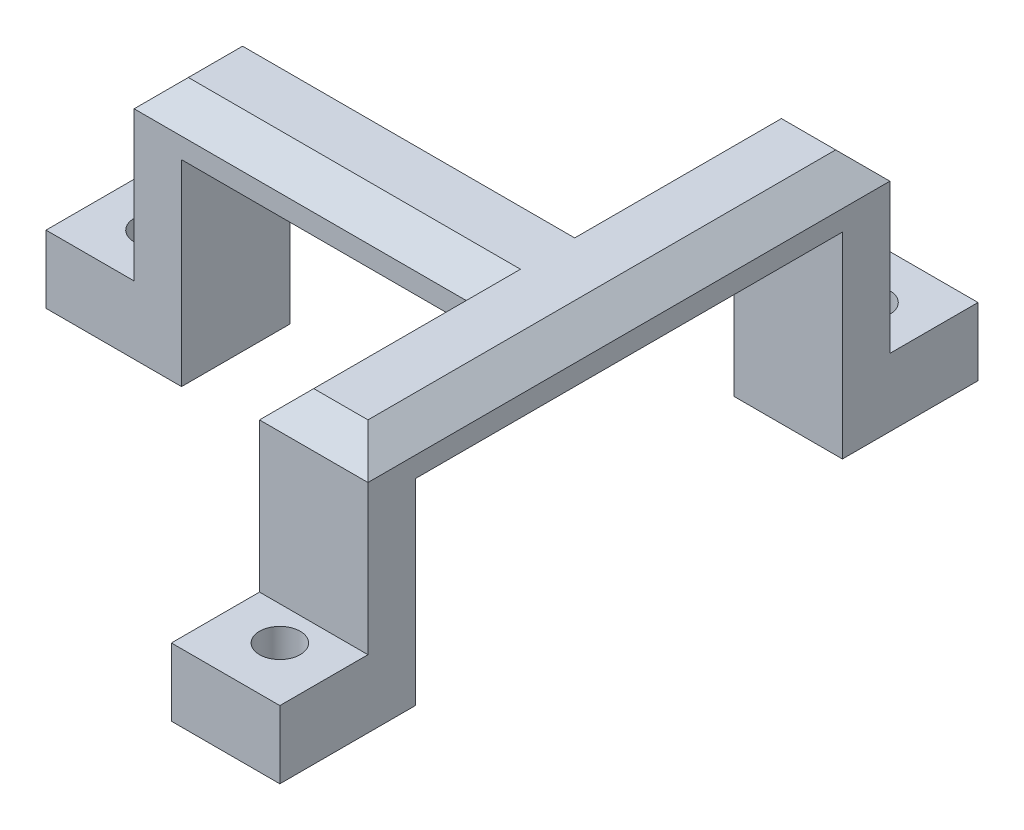
ISO-10303-21;
HEADER;
FILE_DESCRIPTION(('STEP AP214'),'2;1');
FILE_NAME('part.step','',(''),(''),'','','');
FILE_SCHEMA(('AUTOMOTIVE_DESIGN { 1 0 10303 214 1 1 1 1 }'));
ENDSEC;
DATA;
#1=APPLICATION_CONTEXT('core data for automotive mechanical design processes');
#2=APPLICATION_PROTOCOL_DEFINITION('international standard','automotive_design',2000,#1);
#3=PRODUCT_CONTEXT('',#1,'mechanical');
#4=PRODUCT('Part','Part','',(#3));
#5=PRODUCT_RELATED_PRODUCT_CATEGORY('part','',(#4));
#6=PRODUCT_DEFINITION_FORMATION('','',#4);
#7=PRODUCT_DEFINITION_CONTEXT('part definition',#1,'design');
#8=PRODUCT_DEFINITION('design','',#6,#7);
#9=PRODUCT_DEFINITION_SHAPE('','',#8);
#10=(LENGTH_UNIT() NAMED_UNIT(*) SI_UNIT(.MILLI.,.METRE.));
#11=(NAMED_UNIT(*) PLANE_ANGLE_UNIT() SI_UNIT($,.RADIAN.));
#12=(NAMED_UNIT(*) SI_UNIT($,.STERADIAN.) SOLID_ANGLE_UNIT());
#13=UNCERTAINTY_MEASURE_WITH_UNIT(LENGTH_MEASURE(1.E-05),#10,'distance_accuracy_value','');
#14=(GEOMETRIC_REPRESENTATION_CONTEXT(3) GLOBAL_UNCERTAINTY_ASSIGNED_CONTEXT((#13)) GLOBAL_UNIT_ASSIGNED_CONTEXT((#10,
#11,#12)) REPRESENTATION_CONTEXT('',''));
#15=CARTESIAN_POINT('',(0.,0.,0.));
#16=DIRECTION('',(0.,0.,1.));
#17=DIRECTION('',(1.,0.,0.));
#18=AXIS2_PLACEMENT_3D('',#15,#16,#17);
#19=CARTESIAN_POINT('',(-4.,5.,15.75));
#20=DIRECTION('',(0.,0.,1.));
#21=DIRECTION('',(1.,0.,0.));
#22=AXIS2_PLACEMENT_3D('',#19,#20,#21);
#23=PLANE('',#22);
#24=DIRECTION('',(-1.,0.,0.));
#25=VECTOR('',#24,1.);
#26=CARTESIAN_POINT('',(4.,14.5,15.75));
#27=LINE('',#26,#25);
#28=CARTESIAN_POINT('',(4.,14.5,15.75));
#29=VERTEX_POINT('',#28);
#30=CARTESIAN_POINT('',(-4.,14.5,15.75));
#31=VERTEX_POINT('',#30);
#32=EDGE_CURVE('E361',#29,#31,#27,.T.);
#33=ORIENTED_EDGE('',*,*,#32,.F.);
#34=DIRECTION('',(0.,-1.,0.));
#35=VECTOR('',#34,1.);
#36=CARTESIAN_POINT('',(4.,5.,15.75));
#37=LINE('',#36,#35);
#38=CARTESIAN_POINT('',(4.,0.,15.75));
#39=VERTEX_POINT('',#38);
#40=EDGE_CURVE('E422',#29,#39,#37,.T.);
#41=ORIENTED_EDGE('',*,*,#40,.T.);
#42=DIRECTION('',(-1.,0.,0.));
#43=VECTOR('',#42,1.);
#44=CARTESIAN_POINT('',(-4.,0.,15.75));
#45=LINE('',#44,#43);
#46=CARTESIAN_POINT('',(-4.,0.,15.75));
#47=VERTEX_POINT('',#46);
#48=EDGE_CURVE('E399',#39,#47,#45,.T.);
#49=ORIENTED_EDGE('',*,*,#48,.T.);
#50=DIRECTION('',(0.,-1.,0.));
#51=VECTOR('',#50,1.);
#52=CARTESIAN_POINT('',(-4.,5.,15.75));
#53=LINE('',#52,#51);
#54=EDGE_CURVE('E406',#31,#47,#53,.T.);
#55=ORIENTED_EDGE('',*,*,#54,.F.);
#56=EDGE_LOOP('',(#33,#41,#49,#55));
#57=FACE_BOUND('',#56,.T.);
#58=ADVANCED_FACE('F43',(#57),#23,.F.);
#59=CARTESIAN_POINT('',(0.,5.,0.));
#60=DIRECTION('',(0.,1.,0.));
#61=DIRECTION('',(0.,0.,1.));
#62=AXIS2_PLACEMENT_3D('',#59,#60,#61);
#63=PLANE('',#62);
#64=DIRECTION('',(1.,0.,0.));
#65=VECTOR('',#64,1.);
#66=CARTESIAN_POINT('',(-4.,5.,19.25));
#67=LINE('',#66,#65);
#68=CARTESIAN_POINT('',(-4.,5.,19.25));
#69=VERTEX_POINT('',#68);
#70=CARTESIAN_POINT('',(4.,5.,19.25));
#71=VERTEX_POINT('',#70);
#72=EDGE_CURVE('E370',#69,#71,#67,.T.);
#73=ORIENTED_EDGE('',*,*,#72,.F.);
#74=DIRECTION('',(0.,0.,1.));
#75=VECTOR('',#74,1.);
#76=CARTESIAN_POINT('',(-4.,5.,15.75));
#77=LINE('',#76,#75);
#78=CARTESIAN_POINT('',(-4.,5.,25.75));
#79=VERTEX_POINT('',#78);
#80=EDGE_CURVE('E395',#69,#79,#77,.T.);
#81=ORIENTED_EDGE('',*,*,#80,.T.);
#82=DIRECTION('',(1.,0.,0.));
#83=VECTOR('',#82,1.);
#84=CARTESIAN_POINT('',(-4.,5.,25.75));
#85=LINE('',#84,#83);
#86=CARTESIAN_POINT('',(4.,5.,25.75));
#87=VERTEX_POINT('',#86);
#88=EDGE_CURVE('E398',#79,#87,#85,.T.);
#89=ORIENTED_EDGE('',*,*,#88,.T.);
#90=DIRECTION('',(0.,0.,-1.));
#91=VECTOR('',#90,1.);
#92=CARTESIAN_POINT('',(4.,5.,15.75));
#93=LINE('',#92,#91);
#94=EDGE_CURVE('E402',#87,#71,#93,.T.);
#95=ORIENTED_EDGE('',*,*,#94,.T.);
#96=EDGE_LOOP('',(#73,#81,#89,#95));
#97=FACE_BOUND('',#96,.T.);
#98=CARTESIAN_POINT('',(0.,5.,21.75));
#99=DIRECTION('',(0.,1.,0.));
#100=DIRECTION('',(0.,0.,1.));
#101=AXIS2_PLACEMENT_3D('',#98,#99,#100);
#102=CIRCLE('',#101,1.5);
#103=CARTESIAN_POINT('',(0.,5.,23.25));
#104=VERTEX_POINT('',#103);
#105=EDGE_CURVE('E387',#104,#104,#102,.T.);
#106=ORIENTED_EDGE('',*,*,#105,.F.);
#107=EDGE_LOOP('',(#106));
#108=FACE_BOUND('',#107,.T.);
#109=ADVANCED_FACE('F595',(#97,#108),#63,.T.);
#110=CARTESIAN_POINT('',(0.,0.,0.));
#111=DIRECTION('',(0.,1.,0.));
#112=DIRECTION('',(0.,0.,1.));
#113=AXIS2_PLACEMENT_3D('',#110,#111,#112);
#114=PLANE('',#113);
#115=DIRECTION('',(0.,0.,1.));
#116=VECTOR('',#115,1.);
#117=CARTESIAN_POINT('',(-4.,0.,15.75));
#118=LINE('',#117,#116);
#119=CARTESIAN_POINT('',(-4.,0.,25.75));
#120=VERTEX_POINT('',#119);
#121=EDGE_CURVE('E391',#47,#120,#118,.T.);
#122=ORIENTED_EDGE('',*,*,#121,.F.);
#123=ORIENTED_EDGE('',*,*,#48,.F.);
#124=DIRECTION('',(0.,0.,-1.));
#125=VECTOR('',#124,1.);
#126=CARTESIAN_POINT('',(4.,0.,15.75));
#127=LINE('',#126,#125);
#128=CARTESIAN_POINT('',(4.,0.,25.75));
#129=VERTEX_POINT('',#128);
#130=EDGE_CURVE('E413',#129,#39,#127,.T.);
#131=ORIENTED_EDGE('',*,*,#130,.F.);
#132=DIRECTION('',(1.,0.,0.));
#133=VECTOR('',#132,1.);
#134=CARTESIAN_POINT('',(-4.,0.,25.75));
#135=LINE('',#134,#133);
#136=EDGE_CURVE('E410',#120,#129,#135,.T.);
#137=ORIENTED_EDGE('',*,*,#136,.F.);
#138=EDGE_LOOP('',(#122,#123,#131,#137));
#139=FACE_BOUND('',#138,.T.);
#140=CARTESIAN_POINT('',(0.,0.,21.75));
#141=DIRECTION('',(0.,1.,0.));
#142=DIRECTION('',(0.,0.,1.));
#143=AXIS2_PLACEMENT_3D('',#140,#141,#142);
#144=CIRCLE('',#143,1.5);
#145=CARTESIAN_POINT('',(0.,0.,23.25));
#146=VERTEX_POINT('',#145);
#147=EDGE_CURVE('E386',#146,#146,#144,.T.);
#148=ORIENTED_EDGE('',*,*,#147,.T.);
#149=EDGE_LOOP('',(#148));
#150=FACE_BOUND('',#149,.T.);
#151=ADVANCED_FACE('F586',(#139,#150),#114,.F.);
#152=CARTESIAN_POINT('',(-4.,5.,15.75));
#153=DIRECTION('',(1.,0.,0.));
#154=DIRECTION('',(0.,0.,-1.));
#155=AXIS2_PLACEMENT_3D('',#152,#153,#154);
#156=PLANE('',#155);
#157=DIRECTION('',(0.,-1.,0.));
#158=VECTOR('',#157,1.);
#159=CARTESIAN_POINT('',(-4.,18.,19.25));
#160=LINE('',#159,#158);
#161=CARTESIAN_POINT('',(-4.,16.,19.25));
#162=VERTEX_POINT('',#161);
#163=EDGE_CURVE('E383',#162,#69,#160,.T.);
#164=ORIENTED_EDGE('',*,*,#163,.F.);
#165=DIRECTION('',(0.,0.,-1.));
#166=VECTOR('',#165,1.);
#167=CARTESIAN_POINT('',(-4.,16.,15.75));
#168=LINE('',#167,#166);
#169=CARTESIAN_POINT('',(-4.,16.,4.));
#170=VERTEX_POINT('',#169);
#171=EDGE_CURVE('E11',#162,#170,#168,.T.);
#172=ORIENTED_EDGE('',*,*,#171,.T.);
#173=DIRECTION('',(0.,1.,0.));
#174=VECTOR('',#173,1.);
#175=CARTESIAN_POINT('',(-4.,18.,4.));
#176=LINE('',#175,#174);
#177=CARTESIAN_POINT('',(-4.,14.5,4.));
#178=VERTEX_POINT('',#177);
#179=EDGE_CURVE('E366',#178,#170,#176,.T.);
#180=ORIENTED_EDGE('',*,*,#179,.F.);
#181=DIRECTION('',(0.,0.,1.));
#182=VECTOR('',#181,1.);
#183=CARTESIAN_POINT('',(-4.,14.5,-4.73212459828649));
#184=LINE('',#183,#182);
#185=EDGE_CURVE('E365',#178,#31,#184,.T.);
#186=ORIENTED_EDGE('',*,*,#185,.T.);
#187=ORIENTED_EDGE('',*,*,#54,.T.);
#188=ORIENTED_EDGE('',*,*,#121,.T.);
#189=DIRECTION('',(0.,-1.,0.));
#190=VECTOR('',#189,1.);
#191=CARTESIAN_POINT('',(-4.,5.,25.75));
#192=LINE('',#191,#190);
#193=EDGE_CURVE('E429',#79,#120,#192,.T.);
#194=ORIENTED_EDGE('',*,*,#193,.F.);
#195=ORIENTED_EDGE('',*,*,#80,.F.);
#196=EDGE_LOOP('',(#164,#172,#180,#186,#187,#188,#194,#195));
#197=FACE_BOUND('',#196,.T.);
#198=ADVANCED_FACE('F524',(#197),#156,.F.);
#199=CARTESIAN_POINT('',(-4.,5.,25.75));
#200=DIRECTION('',(0.,0.,-1.));
#201=DIRECTION('',(-1.,0.,0.));
#202=AXIS2_PLACEMENT_3D('',#199,#200,#201);
#203=PLANE('',#202);
#204=ORIENTED_EDGE('',*,*,#136,.T.);
#205=DIRECTION('',(0.,-1.,0.));
#206=VECTOR('',#205,1.);
#207=CARTESIAN_POINT('',(4.,5.,25.75));
#208=LINE('',#207,#206);
#209=EDGE_CURVE('E425',#87,#129,#208,.T.);
#210=ORIENTED_EDGE('',*,*,#209,.F.);
#211=ORIENTED_EDGE('',*,*,#88,.F.);
#212=ORIENTED_EDGE('',*,*,#193,.T.);
#213=EDGE_LOOP('',(#204,#210,#211,#212));
#214=FACE_BOUND('',#213,.T.);
#215=ADVANCED_FACE('F591',(#214),#203,.F.);
#216=CARTESIAN_POINT('',(4.,5.,15.75));
#217=DIRECTION('',(-1.,0.,0.));
#218=DIRECTION('',(0.,0.,1.));
#219=AXIS2_PLACEMENT_3D('',#216,#217,#218);
#220=PLANE('',#219);
#221=DIRECTION('',(0.,-1.,0.));
#222=VECTOR('',#221,1.);
#223=CARTESIAN_POINT('',(4.,18.,-19.25));
#224=LINE('',#223,#222);
#225=CARTESIAN_POINT('',(4.,16.,-19.25));
#226=VERTEX_POINT('',#225);
#227=CARTESIAN_POINT('',(4.,5.,-19.25));
#228=VERTEX_POINT('',#227);
#229=EDGE_CURVE('E311',#226,#228,#224,.T.);
#230=ORIENTED_EDGE('',*,*,#229,.F.);
#231=DIRECTION('',(0.,0.,1.));
#232=VECTOR('',#231,1.);
#233=CARTESIAN_POINT('',(4.,16.,15.75));
#234=LINE('',#233,#232);
#235=CARTESIAN_POINT('',(4.,16.,19.25));
#236=VERTEX_POINT('',#235);
#237=EDGE_CURVE('E69',#226,#236,#234,.T.);
#238=ORIENTED_EDGE('',*,*,#237,.T.);
#239=DIRECTION('',(0.,-1.,0.));
#240=VECTOR('',#239,1.);
#241=CARTESIAN_POINT('',(4.,18.,19.25));
#242=LINE('',#241,#240);
#243=EDGE_CURVE('E380',#236,#71,#242,.T.);
#244=ORIENTED_EDGE('',*,*,#243,.T.);
#245=ORIENTED_EDGE('',*,*,#94,.F.);
#246=ORIENTED_EDGE('',*,*,#209,.T.);
#247=ORIENTED_EDGE('',*,*,#130,.T.);
#248=ORIENTED_EDGE('',*,*,#40,.F.);
#249=DIRECTION('',(0.,0.,1.));
#250=VECTOR('',#249,1.);
#251=CARTESIAN_POINT('',(4.,14.5,-4.73212459828649));
#252=LINE('',#251,#250);
#253=CARTESIAN_POINT('',(4.,14.5,-15.75));
#254=VERTEX_POINT('',#253);
#255=EDGE_CURVE('E360',#254,#29,#252,.T.);
#256=ORIENTED_EDGE('',*,*,#255,.F.);
#257=DIRECTION('',(0.,-1.,0.));
#258=VECTOR('',#257,1.);
#259=CARTESIAN_POINT('',(4.,5.,-15.75));
#260=LINE('',#259,#258);
#261=CARTESIAN_POINT('',(4.,0.,-15.75));
#262=VERTEX_POINT('',#261);
#263=EDGE_CURVE('E354',#254,#262,#260,.T.);
#264=ORIENTED_EDGE('',*,*,#263,.T.);
#265=DIRECTION('',(0.,0.,-1.));
#266=VECTOR('',#265,1.);
#267=CARTESIAN_POINT('',(4.,0.,-25.75));
#268=LINE('',#267,#266);
#269=CARTESIAN_POINT('',(4.,0.,-25.75));
#270=VERTEX_POINT('',#269);
#271=EDGE_CURVE('E342',#262,#270,#268,.T.);
#272=ORIENTED_EDGE('',*,*,#271,.T.);
#273=DIRECTION('',(0.,-1.,0.));
#274=VECTOR('',#273,1.);
#275=CARTESIAN_POINT('',(4.,5.,-25.75));
#276=LINE('',#275,#274);
#277=CARTESIAN_POINT('',(4.,5.,-25.75));
#278=VERTEX_POINT('',#277);
#279=EDGE_CURVE('E350',#278,#270,#276,.T.);
#280=ORIENTED_EDGE('',*,*,#279,.F.);
#281=DIRECTION('',(0.,0.,-1.));
#282=VECTOR('',#281,1.);
#283=CARTESIAN_POINT('',(4.,5.,-25.75));
#284=LINE('',#283,#282);
#285=EDGE_CURVE('E327',#228,#278,#284,.T.);
#286=ORIENTED_EDGE('',*,*,#285,.F.);
#287=EDGE_LOOP('',(#230,#238,#244,#245,#246,#247,#248,#256,#264,#272,#280,#286));
#288=FACE_BOUND('',#287,.T.);
#289=ADVANCED_FACE('F563',(#288),#220,.F.);
#290=CARTESIAN_POINT('',(0.,5.,21.75));
#291=DIRECTION('',(0.,-1.,0.));
#292=DIRECTION('',(0.,0.,-1.));
#293=AXIS2_PLACEMENT_3D('',#290,#291,#292);
#294=CYLINDRICAL_SURFACE('',#293,1.5);
#295=ORIENTED_EDGE('',*,*,#105,.T.);
#296=EDGE_LOOP('',(#295));
#297=FACE_BOUND('',#296,.T.);
#298=ORIENTED_EDGE('',*,*,#147,.F.);
#299=EDGE_LOOP('',(#298));
#300=FACE_BOUND('',#299,.T.);
#301=ADVANCED_FACE('F599',(#297,#300),#294,.F.);
#302=CARTESIAN_POINT('',(-4.,18.,19.25));
#303=DIRECTION('',(0.,0.,-1.));
#304=DIRECTION('',(-1.,0.,0.));
#305=AXIS2_PLACEMENT_3D('',#302,#303,#304);
#306=PLANE('',#305);
#307=ORIENTED_EDGE('',*,*,#243,.F.);
#308=DIRECTION('',(-1.,0.,0.));
#309=VECTOR('',#308,1.);
#310=CARTESIAN_POINT('',(-4.,16.,19.25));
#311=LINE('',#310,#309);
#312=EDGE_CURVE('E54',#236,#162,#311,.T.);
#313=ORIENTED_EDGE('',*,*,#312,.T.);
#314=ORIENTED_EDGE('',*,*,#163,.T.);
#315=ORIENTED_EDGE('',*,*,#72,.T.);
#316=EDGE_LOOP('',(#307,#313,#314,#315));
#317=FACE_BOUND('',#316,.T.);
#318=ADVANCED_FACE('F597',(#317),#306,.F.);
#319=CARTESIAN_POINT('',(0.,18.,0.));
#320=DIRECTION('',(0.,-1.,0.));
#321=DIRECTION('',(0.,0.,-1.));
#322=AXIS2_PLACEMENT_3D('',#319,#320,#321);
#323=PLANE('',#322);
#324=DIRECTION('',(0.,0.,1.));
#325=VECTOR('',#324,1.);
#326=CARTESIAN_POINT('',(-26.5,18.,0.));
#327=LINE('',#326,#325);
#328=CARTESIAN_POINT('',(-26.5,18.,-2.00000000000001));
#329=VERTEX_POINT('',#328);
#330=CARTESIAN_POINT('',(-26.5,18.,2.00000000000001));
#331=VERTEX_POINT('',#330);
#332=EDGE_CURVE('E451',#329,#331,#327,.T.);
#333=ORIENTED_EDGE('',*,*,#332,.T.);
#334=DIRECTION('',(1.,0.,0.));
#335=VECTOR('',#334,1.);
#336=CARTESIAN_POINT('',(0.,18.,2.00000000000001));
#337=LINE('',#336,#335);
#338=CARTESIAN_POINT('',(-2.00000000000001,18.,2.00000000000001));
#339=VERTEX_POINT('',#338);
#340=EDGE_CURVE('E454',#331,#339,#337,.T.);
#341=ORIENTED_EDGE('',*,*,#340,.T.);
#342=DIRECTION('',(0.,0.,1.));
#343=VECTOR('',#342,1.);
#344=CARTESIAN_POINT('',(-2.00000000000002,18.,0.));
#345=LINE('',#344,#343);
#346=CARTESIAN_POINT('',(-2.00000000000001,18.,17.25));
#347=VERTEX_POINT('',#346);
#348=EDGE_CURVE('E433',#339,#347,#345,.T.);
#349=ORIENTED_EDGE('',*,*,#348,.T.);
#350=DIRECTION('',(1.,0.,0.));
#351=VECTOR('',#350,1.);
#352=CARTESIAN_POINT('',(0.,18.,17.25));
#353=LINE('',#352,#351);
#354=CARTESIAN_POINT('',(2.00000000000001,18.,17.25));
#355=VERTEX_POINT('',#354);
#356=EDGE_CURVE('E436',#347,#355,#353,.T.);
#357=ORIENTED_EDGE('',*,*,#356,.T.);
#358=DIRECTION('',(0.,0.,-1.));
#359=VECTOR('',#358,1.);
#360=CARTESIAN_POINT('',(2.00000000000001,18.,0.));
#361=LINE('',#360,#359);
#362=CARTESIAN_POINT('',(2.00000000000001,18.,-17.25));
#363=VERTEX_POINT('',#362);
#364=EDGE_CURVE('E439',#355,#363,#361,.T.);
#365=ORIENTED_EDGE('',*,*,#364,.T.);
#366=DIRECTION('',(-1.,0.,0.));
#367=VECTOR('',#366,1.);
#368=CARTESIAN_POINT('',(0.,18.,-17.25));
#369=LINE('',#368,#367);
#370=CARTESIAN_POINT('',(-2.00000000000001,18.,-17.25));
#371=VERTEX_POINT('',#370);
#372=EDGE_CURVE('E442',#363,#371,#369,.T.);
#373=ORIENTED_EDGE('',*,*,#372,.T.);
#374=DIRECTION('',(0.,0.,1.));
#375=VECTOR('',#374,1.);
#376=CARTESIAN_POINT('',(-2.00000000000001,18.,0.));
#377=LINE('',#376,#375);
#378=CARTESIAN_POINT('',(-2.00000000000001,18.,-2.00000000000001));
#379=VERTEX_POINT('',#378);
#380=EDGE_CURVE('E445',#371,#379,#377,.T.);
#381=ORIENTED_EDGE('',*,*,#380,.T.);
#382=DIRECTION('',(-1.,0.,0.));
#383=VECTOR('',#382,1.);
#384=CARTESIAN_POINT('',(0.,18.,-2.00000000000001));
#385=LINE('',#384,#383);
#386=EDGE_CURVE('E448',#379,#329,#385,.T.);
#387=ORIENTED_EDGE('',*,*,#386,.T.);
#388=EDGE_LOOP('',(#333,#341,#349,#357,#365,#373,#381,#387));
#389=FACE_BOUND('',#388,.T.);
#390=ADVANCED_FACE('F512',(#389),#323,.F.);
#391=CARTESIAN_POINT('',(4.,14.5,-4.73212459828649));
#392=DIRECTION('',(0.,1.,0.));
#393=DIRECTION('',(0.,0.,1.));
#394=AXIS2_PLACEMENT_3D('',#391,#392,#393);
#395=PLANE('',#394);
#396=ORIENTED_EDGE('',*,*,#185,.F.);
#397=DIRECTION('',(-1.,0.,0.));
#398=VECTOR('',#397,1.);
#399=CARTESIAN_POINT('',(12.7321245982865,14.5,4.));
#400=LINE('',#399,#398);
#401=CARTESIAN_POINT('',(-25.,14.5,4.));
#402=VERTEX_POINT('',#401);
#403=EDGE_CURVE('E219',#178,#402,#400,.T.);
#404=ORIENTED_EDGE('',*,*,#403,.T.);
#405=DIRECTION('',(0.,0.,-1.));
#406=VECTOR('',#405,1.);
#407=CARTESIAN_POINT('',(-25.,14.5,-4.));
#408=LINE('',#407,#406);
#409=CARTESIAN_POINT('',(-25.,14.5,-4.));
#410=VERTEX_POINT('',#409);
#411=EDGE_CURVE('E220',#402,#410,#408,.T.);
#412=ORIENTED_EDGE('',*,*,#411,.T.);
#413=DIRECTION('',(-1.,0.,0.));
#414=VECTOR('',#413,1.);
#415=CARTESIAN_POINT('',(12.7321245982865,14.5,-4.));
#416=LINE('',#415,#414);
#417=CARTESIAN_POINT('',(-4.,14.5,-4.));
#418=VERTEX_POINT('',#417);
#419=EDGE_CURVE('E206',#418,#410,#416,.T.);
#420=ORIENTED_EDGE('',*,*,#419,.F.);
#421=DIRECTION('',(0.,0.,-1.));
#422=VECTOR('',#421,1.);
#423=CARTESIAN_POINT('',(-4.,14.5,4.73212459828649));
#424=LINE('',#423,#422);
#425=CARTESIAN_POINT('',(-4.,14.5,-15.75));
#426=VERTEX_POINT('',#425);
#427=EDGE_CURVE('E295',#418,#426,#424,.T.);
#428=ORIENTED_EDGE('',*,*,#427,.T.);
#429=DIRECTION('',(1.,0.,0.));
#430=VECTOR('',#429,1.);
#431=CARTESIAN_POINT('',(4.,14.5,-15.75));
#432=LINE('',#431,#430);
#433=EDGE_CURVE('E296',#426,#254,#432,.T.);
#434=ORIENTED_EDGE('',*,*,#433,.T.);
#435=ORIENTED_EDGE('',*,*,#255,.T.);
#436=ORIENTED_EDGE('',*,*,#32,.T.);
#437=EDGE_LOOP('',(#396,#404,#412,#420,#428,#434,#435,#436));
#438=FACE_BOUND('',#437,.T.);
#439=ADVANCED_FACE('F234',(#438),#395,.F.);
#440=CARTESIAN_POINT('',(-35.,5.,4.));
#441=DIRECTION('',(0.,0.,-1.));
#442=DIRECTION('',(-1.,0.,0.));
#443=AXIS2_PLACEMENT_3D('',#440,#441,#442);
#444=PLANE('',#443);
#445=ORIENTED_EDGE('',*,*,#179,.T.);
#446=DIRECTION('',(-1.,0.,0.));
#447=VECTOR('',#446,1.);
#448=CARTESIAN_POINT('',(-35.,16.,4.));
#449=LINE('',#448,#447);
#450=CARTESIAN_POINT('',(-28.5,16.,4.));
#451=VERTEX_POINT('',#450);
#452=EDGE_CURVE('E458',#170,#451,#449,.T.);
#453=ORIENTED_EDGE('',*,*,#452,.T.);
#454=DIRECTION('',(0.,-1.,0.));
#455=VECTOR('',#454,1.);
#456=CARTESIAN_POINT('',(-28.5,18.,4.));
#457=LINE('',#456,#455);
#458=CARTESIAN_POINT('',(-28.5,5.,4.));
#459=VERTEX_POINT('',#458);
#460=EDGE_CURVE('E248',#451,#459,#457,.T.);
#461=ORIENTED_EDGE('',*,*,#460,.T.);
#462=DIRECTION('',(1.,0.,0.));
#463=VECTOR('',#462,1.);
#464=CARTESIAN_POINT('',(-35.,5.,4.));
#465=LINE('',#464,#463);
#466=CARTESIAN_POINT('',(-35.,5.,4.));
#467=VERTEX_POINT('',#466);
#468=EDGE_CURVE('E267',#467,#459,#465,.T.);
#469=ORIENTED_EDGE('',*,*,#468,.F.);
#470=DIRECTION('',(0.,-1.,0.));
#471=VECTOR('',#470,1.);
#472=CARTESIAN_POINT('',(-35.,5.,4.));
#473=LINE('',#472,#471);
#474=CARTESIAN_POINT('',(-35.,0.,4.));
#475=VERTEX_POINT('',#474);
#476=EDGE_CURVE('E291',#467,#475,#473,.T.);
#477=ORIENTED_EDGE('',*,*,#476,.T.);
#478=DIRECTION('',(1.,0.,0.));
#479=VECTOR('',#478,1.);
#480=CARTESIAN_POINT('',(-35.,0.,4.));
#481=LINE('',#480,#479);
#482=CARTESIAN_POINT('',(-25.,0.,4.));
#483=VERTEX_POINT('',#482);
#484=EDGE_CURVE('E278',#475,#483,#481,.T.);
#485=ORIENTED_EDGE('',*,*,#484,.T.);
#486=DIRECTION('',(0.,-1.,0.));
#487=VECTOR('',#486,1.);
#488=CARTESIAN_POINT('',(-25.,5.,4.));
#489=LINE('',#488,#487);
#490=EDGE_CURVE('E230',#402,#483,#489,.T.);
#491=ORIENTED_EDGE('',*,*,#490,.F.);
#492=ORIENTED_EDGE('',*,*,#403,.F.);
#493=EDGE_LOOP('',(#445,#453,#461,#469,#477,#485,#491,#492));
#494=FACE_BOUND('',#493,.T.);
#495=ADVANCED_FACE('F528',(#494),#444,.F.);
#496=CARTESIAN_POINT('',(-4.,5.,-15.75));
#497=DIRECTION('',(0.,0.,-1.));
#498=DIRECTION('',(-1.,0.,0.));
#499=AXIS2_PLACEMENT_3D('',#496,#497,#498);
#500=PLANE('',#499);
#501=ORIENTED_EDGE('',*,*,#433,.F.);
#502=DIRECTION('',(0.,-1.,0.));
#503=VECTOR('',#502,1.);
#504=CARTESIAN_POINT('',(-4.,5.,-15.75));
#505=LINE('',#504,#503);
#506=CARTESIAN_POINT('',(-4.,0.,-15.75));
#507=VERTEX_POINT('',#506);
#508=EDGE_CURVE('E357',#426,#507,#505,.T.);
#509=ORIENTED_EDGE('',*,*,#508,.T.);
#510=DIRECTION('',(1.,0.,0.));
#511=VECTOR('',#510,1.);
#512=CARTESIAN_POINT('',(-4.,0.,-15.75));
#513=LINE('',#512,#511);
#514=EDGE_CURVE('E338',#507,#262,#513,.T.);
#515=ORIENTED_EDGE('',*,*,#514,.T.);
#516=ORIENTED_EDGE('',*,*,#263,.F.);
#517=EDGE_LOOP('',(#501,#509,#515,#516));
#518=FACE_BOUND('',#517,.T.);
#519=ADVANCED_FACE('F578',(#518),#500,.F.);
#520=CARTESIAN_POINT('',(0.,5.,0.));
#521=DIRECTION('',(0.,1.,0.));
#522=DIRECTION('',(0.,0.,1.));
#523=AXIS2_PLACEMENT_3D('',#520,#521,#522);
#524=PLANE('',#523);
#525=DIRECTION('',(-1.,0.,0.));
#526=VECTOR('',#525,1.);
#527=CARTESIAN_POINT('',(-4.,5.,-19.25));
#528=LINE('',#527,#526);
#529=CARTESIAN_POINT('',(-4.,5.,-19.25));
#530=VERTEX_POINT('',#529);
#531=EDGE_CURVE('E302',#228,#530,#528,.T.);
#532=ORIENTED_EDGE('',*,*,#531,.F.);
#533=ORIENTED_EDGE('',*,*,#285,.T.);
#534=DIRECTION('',(-1.,0.,0.));
#535=VECTOR('',#534,1.);
#536=CARTESIAN_POINT('',(-4.,5.,-25.75));
#537=LINE('',#536,#535);
#538=CARTESIAN_POINT('',(-4.,5.,-25.75));
#539=VERTEX_POINT('',#538);
#540=EDGE_CURVE('E331',#278,#539,#537,.T.);
#541=ORIENTED_EDGE('',*,*,#540,.T.);
#542=DIRECTION('',(0.,0.,1.));
#543=VECTOR('',#542,1.);
#544=CARTESIAN_POINT('',(-4.,5.,-25.75));
#545=LINE('',#544,#543);
#546=EDGE_CURVE('E323',#539,#530,#545,.T.);
#547=ORIENTED_EDGE('',*,*,#546,.T.);
#548=EDGE_LOOP('',(#532,#533,#541,#547));
#549=FACE_BOUND('',#548,.T.);
#550=CARTESIAN_POINT('',(0.,5.,-21.75));
#551=DIRECTION('',(0.,1.,0.));
#552=DIRECTION('',(0.,0.,1.));
#553=AXIS2_PLACEMENT_3D('',#550,#551,#552);
#554=CIRCLE('',#553,1.5);
#555=CARTESIAN_POINT('',(0.,5.,-20.25));
#556=VERTEX_POINT('',#555);
#557=EDGE_CURVE('E315',#556,#556,#554,.T.);
#558=ORIENTED_EDGE('',*,*,#557,.F.);
#559=EDGE_LOOP('',(#558));
#560=FACE_BOUND('',#559,.T.);
#561=ADVANCED_FACE('F560',(#549,#560),#524,.T.);
#562=CARTESIAN_POINT('',(0.,0.,0.));
#563=DIRECTION('',(0.,1.,0.));
#564=DIRECTION('',(0.,0.,1.));
#565=AXIS2_PLACEMENT_3D('',#562,#563,#564);
#566=PLANE('',#565);
#567=DIRECTION('',(0.,0.,1.));
#568=VECTOR('',#567,1.);
#569=CARTESIAN_POINT('',(-4.,0.,-25.75));
#570=LINE('',#569,#568);
#571=CARTESIAN_POINT('',(-4.,0.,-25.75));
#572=VERTEX_POINT('',#571);
#573=EDGE_CURVE('E319',#572,#507,#570,.T.);
#574=ORIENTED_EDGE('',*,*,#573,.F.);
#575=DIRECTION('',(-1.,0.,0.));
#576=VECTOR('',#575,1.);
#577=CARTESIAN_POINT('',(-4.,0.,-25.75));
#578=LINE('',#577,#576);
#579=EDGE_CURVE('E328',#270,#572,#578,.T.);
#580=ORIENTED_EDGE('',*,*,#579,.F.);
#581=ORIENTED_EDGE('',*,*,#271,.F.);
#582=ORIENTED_EDGE('',*,*,#514,.F.);
#583=EDGE_LOOP('',(#574,#580,#581,#582));
#584=FACE_BOUND('',#583,.T.);
#585=CARTESIAN_POINT('',(0.,0.,-21.75));
#586=DIRECTION('',(0.,1.,0.));
#587=DIRECTION('',(0.,0.,1.));
#588=AXIS2_PLACEMENT_3D('',#585,#586,#587);
#589=CIRCLE('',#588,1.5);
#590=CARTESIAN_POINT('',(0.,0.,-20.25));
#591=VERTEX_POINT('',#590);
#592=EDGE_CURVE('E314',#591,#591,#589,.T.);
#593=ORIENTED_EDGE('',*,*,#592,.T.);
#594=EDGE_LOOP('',(#593));
#595=FACE_BOUND('',#594,.T.);
#596=ADVANCED_FACE('F574',(#584,#595),#566,.F.);
#597=CARTESIAN_POINT('',(-4.,5.,-25.75));
#598=DIRECTION('',(1.,0.,0.));
#599=DIRECTION('',(0.,0.,-1.));
#600=AXIS2_PLACEMENT_3D('',#597,#598,#599);
#601=PLANE('',#600);
#602=DIRECTION('',(0.,-1.,0.));
#603=VECTOR('',#602,1.);
#604=CARTESIAN_POINT('',(-4.,18.,-4.));
#605=LINE('',#604,#603);
#606=CARTESIAN_POINT('',(-4.,16.,-4.));
#607=VERTEX_POINT('',#606);
#608=EDGE_CURVE('E213',#607,#418,#605,.T.);
#609=ORIENTED_EDGE('',*,*,#608,.F.);
#610=DIRECTION('',(0.,0.,-1.));
#611=VECTOR('',#610,1.);
#612=CARTESIAN_POINT('',(-4.,16.,-25.75));
#613=LINE('',#612,#611);
#614=CARTESIAN_POINT('',(-4.,16.,-19.25));
#615=VERTEX_POINT('',#614);
#616=EDGE_CURVE('E468',#607,#615,#613,.T.);
#617=ORIENTED_EDGE('',*,*,#616,.T.);
#618=DIRECTION('',(0.,-1.,0.));
#619=VECTOR('',#618,1.);
#620=CARTESIAN_POINT('',(-4.,18.,-19.25));
#621=LINE('',#620,#619);
#622=EDGE_CURVE('E308',#615,#530,#621,.T.);
#623=ORIENTED_EDGE('',*,*,#622,.T.);
#624=ORIENTED_EDGE('',*,*,#546,.F.);
#625=DIRECTION('',(0.,-1.,0.));
#626=VECTOR('',#625,1.);
#627=CARTESIAN_POINT('',(-4.,5.,-25.75));
#628=LINE('',#627,#626);
#629=EDGE_CURVE('E334',#539,#572,#628,.T.);
#630=ORIENTED_EDGE('',*,*,#629,.T.);
#631=ORIENTED_EDGE('',*,*,#573,.T.);
#632=ORIENTED_EDGE('',*,*,#508,.F.);
#633=ORIENTED_EDGE('',*,*,#427,.F.);
#634=EDGE_LOOP('',(#609,#617,#623,#624,#630,#631,#632,#633));
#635=FACE_BOUND('',#634,.T.);
#636=ADVANCED_FACE('F553',(#635),#601,.F.);
#637=CARTESIAN_POINT('',(-4.,5.,-25.75));
#638=DIRECTION('',(0.,0.,1.));
#639=DIRECTION('',(1.,0.,0.));
#640=AXIS2_PLACEMENT_3D('',#637,#638,#639);
#641=PLANE('',#640);
#642=ORIENTED_EDGE('',*,*,#579,.T.);
#643=ORIENTED_EDGE('',*,*,#629,.F.);
#644=ORIENTED_EDGE('',*,*,#540,.F.);
#645=ORIENTED_EDGE('',*,*,#279,.T.);
#646=EDGE_LOOP('',(#642,#643,#644,#645));
#647=FACE_BOUND('',#646,.T.);
#648=ADVANCED_FACE('F569',(#647),#641,.F.);
#649=CARTESIAN_POINT('',(0.,5.,-21.75));
#650=DIRECTION('',(0.,-1.,0.));
#651=DIRECTION('',(0.,0.,-1.));
#652=AXIS2_PLACEMENT_3D('',#649,#650,#651);
#653=CYLINDRICAL_SURFACE('',#652,1.5);
#654=ORIENTED_EDGE('',*,*,#557,.T.);
#655=EDGE_LOOP('',(#654));
#656=FACE_BOUND('',#655,.T.);
#657=ORIENTED_EDGE('',*,*,#592,.F.);
#658=EDGE_LOOP('',(#657));
#659=FACE_BOUND('',#658,.T.);
#660=ADVANCED_FACE('F689',(#656,#659),#653,.F.);
#661=CARTESIAN_POINT('',(-4.,18.,-19.25));
#662=DIRECTION('',(0.,0.,1.));
#663=DIRECTION('',(1.,0.,0.));
#664=AXIS2_PLACEMENT_3D('',#661,#662,#663);
#665=PLANE('',#664);
#666=ORIENTED_EDGE('',*,*,#622,.F.);
#667=DIRECTION('',(1.,0.,0.));
#668=VECTOR('',#667,1.);
#669=CARTESIAN_POINT('',(-4.,16.,-19.25));
#670=LINE('',#669,#668);
#671=EDGE_CURVE('E471',#615,#226,#670,.T.);
#672=ORIENTED_EDGE('',*,*,#671,.T.);
#673=ORIENTED_EDGE('',*,*,#229,.T.);
#674=ORIENTED_EDGE('',*,*,#531,.T.);
#675=EDGE_LOOP('',(#666,#672,#673,#674));
#676=FACE_BOUND('',#675,.T.);
#677=ADVANCED_FACE('F556',(#676),#665,.F.);
#678=CARTESIAN_POINT('',(-35.,5.,-4.));
#679=DIRECTION('',(0.,0.,1.));
#680=DIRECTION('',(1.,0.,0.));
#681=AXIS2_PLACEMENT_3D('',#678,#679,#680);
#682=PLANE('',#681);
#683=DIRECTION('',(0.,-1.,0.));
#684=VECTOR('',#683,1.);
#685=CARTESIAN_POINT('',(-28.5,18.,-4.));
#686=LINE('',#685,#684);
#687=CARTESIAN_POINT('',(-28.5,16.,-4.));
#688=VERTEX_POINT('',#687);
#689=CARTESIAN_POINT('',(-28.5,5.,-4.));
#690=VERTEX_POINT('',#689);
#691=EDGE_CURVE('E251',#688,#690,#686,.T.);
#692=ORIENTED_EDGE('',*,*,#691,.F.);
#693=DIRECTION('',(1.,0.,0.));
#694=VECTOR('',#693,1.);
#695=CARTESIAN_POINT('',(-35.,16.,-4.));
#696=LINE('',#695,#694);
#697=EDGE_CURVE('E465',#688,#607,#696,.T.);
#698=ORIENTED_EDGE('',*,*,#697,.T.);
#699=ORIENTED_EDGE('',*,*,#608,.T.);
#700=ORIENTED_EDGE('',*,*,#419,.T.);
#701=DIRECTION('',(0.,-1.,0.));
#702=VECTOR('',#701,1.);
#703=CARTESIAN_POINT('',(-25.,5.,-4.));
#704=LINE('',#703,#702);
#705=CARTESIAN_POINT('',(-25.,0.,-4.));
#706=VERTEX_POINT('',#705);
#707=EDGE_CURVE('E210',#410,#706,#704,.T.);
#708=ORIENTED_EDGE('',*,*,#707,.T.);
#709=DIRECTION('',(-1.,0.,0.));
#710=VECTOR('',#709,1.);
#711=CARTESIAN_POINT('',(-35.,0.,-4.));
#712=LINE('',#711,#710);
#713=CARTESIAN_POINT('',(-35.,0.,-4.));
#714=VERTEX_POINT('',#713);
#715=EDGE_CURVE('E268',#706,#714,#712,.T.);
#716=ORIENTED_EDGE('',*,*,#715,.T.);
#717=DIRECTION('',(0.,-1.,0.));
#718=VECTOR('',#717,1.);
#719=CARTESIAN_POINT('',(-35.,5.,-4.));
#720=LINE('',#719,#718);
#721=CARTESIAN_POINT('',(-35.,5.,-4.));
#722=VERTEX_POINT('',#721);
#723=EDGE_CURVE('E231',#722,#714,#720,.T.);
#724=ORIENTED_EDGE('',*,*,#723,.F.);
#725=DIRECTION('',(-1.,0.,0.));
#726=VECTOR('',#725,1.);
#727=CARTESIAN_POINT('',(-35.,5.,-4.));
#728=LINE('',#727,#726);
#729=EDGE_CURVE('E272',#690,#722,#728,.T.);
#730=ORIENTED_EDGE('',*,*,#729,.F.);
#731=EDGE_LOOP('',(#692,#698,#699,#700,#708,#716,#724,#730));
#732=FACE_BOUND('',#731,.T.);
#733=ADVANCED_FACE('F209',(#732),#682,.F.);
#734=CARTESIAN_POINT('',(-25.,5.,-4.));
#735=DIRECTION('',(-1.,0.,0.));
#736=DIRECTION('',(0.,0.,1.));
#737=AXIS2_PLACEMENT_3D('',#734,#735,#736);
#738=PLANE('',#737);
#739=ORIENTED_EDGE('',*,*,#411,.F.);
#740=ORIENTED_EDGE('',*,*,#490,.T.);
#741=DIRECTION('',(0.,0.,-1.));
#742=VECTOR('',#741,1.);
#743=CARTESIAN_POINT('',(-25.,0.,-4.));
#744=LINE('',#743,#742);
#745=EDGE_CURVE('E227',#483,#706,#744,.T.);
#746=ORIENTED_EDGE('',*,*,#745,.T.);
#747=ORIENTED_EDGE('',*,*,#707,.F.);
#748=EDGE_LOOP('',(#739,#740,#746,#747));
#749=FACE_BOUND('',#748,.T.);
#750=ADVANCED_FACE('F224',(#749),#738,.F.);
#751=CARTESIAN_POINT('',(0.,5.,0.));
#752=DIRECTION('',(0.,1.,0.));
#753=DIRECTION('',(0.,0.,1.));
#754=AXIS2_PLACEMENT_3D('',#751,#752,#753);
#755=PLANE('',#754);
#756=DIRECTION('',(0.,0.,1.));
#757=VECTOR('',#756,1.);
#758=CARTESIAN_POINT('',(-28.5,5.,-4.));
#759=LINE('',#758,#757);
#760=EDGE_CURVE('E244',#690,#459,#759,.T.);
#761=ORIENTED_EDGE('',*,*,#760,.F.);
#762=ORIENTED_EDGE('',*,*,#729,.T.);
#763=DIRECTION('',(0.,0.,1.));
#764=VECTOR('',#763,1.);
#765=CARTESIAN_POINT('',(-35.,5.,-4.));
#766=LINE('',#765,#764);
#767=EDGE_CURVE('E263',#722,#467,#766,.T.);
#768=ORIENTED_EDGE('',*,*,#767,.T.);
#769=ORIENTED_EDGE('',*,*,#468,.T.);
#770=EDGE_LOOP('',(#761,#762,#768,#769));
#771=FACE_BOUND('',#770,.T.);
#772=CARTESIAN_POINT('',(-31.,5.,0.));
#773=DIRECTION('',(0.,1.,0.));
#774=DIRECTION('',(0.,0.,1.));
#775=AXIS2_PLACEMENT_3D('',#772,#773,#774);
#776=CIRCLE('',#775,1.5);
#777=CARTESIAN_POINT('',(-31.,5.,1.5));
#778=VERTEX_POINT('',#777);
#779=EDGE_CURVE('E255',#778,#778,#776,.T.);
#780=ORIENTED_EDGE('',*,*,#779,.F.);
#781=EDGE_LOOP('',(#780));
#782=FACE_BOUND('',#781,.T.);
#783=ADVANCED_FACE('F670',(#771,#782),#755,.T.);
#784=CARTESIAN_POINT('',(0.,0.,0.));
#785=DIRECTION('',(0.,1.,0.));
#786=DIRECTION('',(0.,0.,1.));
#787=AXIS2_PLACEMENT_3D('',#784,#785,#786);
#788=PLANE('',#787);
#789=DIRECTION('',(0.,0.,1.));
#790=VECTOR('',#789,1.);
#791=CARTESIAN_POINT('',(-35.,0.,-4.));
#792=LINE('',#791,#790);
#793=EDGE_CURVE('E259',#714,#475,#792,.T.);
#794=ORIENTED_EDGE('',*,*,#793,.F.);
#795=ORIENTED_EDGE('',*,*,#715,.F.);
#796=ORIENTED_EDGE('',*,*,#745,.F.);
#797=ORIENTED_EDGE('',*,*,#484,.F.);
#798=EDGE_LOOP('',(#794,#795,#796,#797));
#799=FACE_BOUND('',#798,.T.);
#800=CARTESIAN_POINT('',(-31.,0.,0.));
#801=DIRECTION('',(0.,1.,0.));
#802=DIRECTION('',(0.,0.,1.));
#803=AXIS2_PLACEMENT_3D('',#800,#801,#802);
#804=CIRCLE('',#803,1.5);
#805=CARTESIAN_POINT('',(-31.,0.,1.5));
#806=VERTEX_POINT('',#805);
#807=EDGE_CURVE('E254',#806,#806,#804,.T.);
#808=ORIENTED_EDGE('',*,*,#807,.T.);
#809=EDGE_LOOP('',(#808));
#810=FACE_BOUND('',#809,.T.);
#811=ADVANCED_FACE('F673',(#799,#810),#788,.F.);
#812=CARTESIAN_POINT('',(-35.,5.,-4.));
#813=DIRECTION('',(1.,0.,0.));
#814=DIRECTION('',(0.,0.,-1.));
#815=AXIS2_PLACEMENT_3D('',#812,#813,#814);
#816=PLANE('',#815);
#817=ORIENTED_EDGE('',*,*,#793,.T.);
#818=ORIENTED_EDGE('',*,*,#476,.F.);
#819=ORIENTED_EDGE('',*,*,#767,.F.);
#820=ORIENTED_EDGE('',*,*,#723,.T.);
#821=EDGE_LOOP('',(#817,#818,#819,#820));
#822=FACE_BOUND('',#821,.T.);
#823=ADVANCED_FACE('F666',(#822),#816,.F.);
#824=CARTESIAN_POINT('',(-31.,5.,0.));
#825=DIRECTION('',(0.,-1.,0.));
#826=DIRECTION('',(0.,0.,-1.));
#827=AXIS2_PLACEMENT_3D('',#824,#825,#826);
#828=CYLINDRICAL_SURFACE('',#827,1.5);
#829=ORIENTED_EDGE('',*,*,#779,.T.);
#830=EDGE_LOOP('',(#829));
#831=FACE_BOUND('',#830,.T.);
#832=ORIENTED_EDGE('',*,*,#807,.F.);
#833=EDGE_LOOP('',(#832));
#834=FACE_BOUND('',#833,.T.);
#835=ADVANCED_FACE('F661',(#831,#834),#828,.F.);
#836=CARTESIAN_POINT('',(-28.5,18.,-4.));
#837=DIRECTION('',(1.,0.,0.));
#838=DIRECTION('',(0.,0.,-1.));
#839=AXIS2_PLACEMENT_3D('',#836,#837,#838);
#840=PLANE('',#839);
#841=ORIENTED_EDGE('',*,*,#460,.F.);
#842=DIRECTION('',(0.,0.,-1.));
#843=VECTOR('',#842,1.);
#844=CARTESIAN_POINT('',(-28.5,16.,-4.));
#845=LINE('',#844,#843);
#846=EDGE_CURVE('E462',#451,#688,#845,.T.);
#847=ORIENTED_EDGE('',*,*,#846,.T.);
#848=ORIENTED_EDGE('',*,*,#691,.T.);
#849=ORIENTED_EDGE('',*,*,#760,.T.);
#850=EDGE_LOOP('',(#841,#847,#848,#849));
#851=FACE_BOUND('',#850,.T.);
#852=ADVANCED_FACE('F540',(#851),#840,.F.);
#853=CARTESIAN_POINT('',(0.,18.,-17.25));
#854=DIRECTION('',(0.,-0.707106781186545,0.70710678118655));
#855=DIRECTION('',(-1.,0.,0.));
#856=AXIS2_PLACEMENT_3D('',#853,#854,#855);
#857=PLANE('',#856);
#858=DIRECTION('',(-0.577350269189624,0.577350269189628,0.577350269189624));
#859=VECTOR('',#858,1.);
#860=CARTESIAN_POINT('',(-3.74999999999997,23.75,-11.5));
#861=LINE('',#860,#859);
#862=EDGE_CURVE('E240',#226,#363,#861,.T.);
#863=ORIENTED_EDGE('',*,*,#862,.F.);
#864=ORIENTED_EDGE('',*,*,#671,.F.);
#865=DIRECTION('',(0.577350269189625,0.577350269189628,0.577350269189624));
#866=VECTOR('',#865,1.);
#867=CARTESIAN_POINT('',(-1.33333333333334,18.6666666666667,-16.5833333333333));
#868=LINE('',#867,#866);
#869=EDGE_CURVE('E48',#371,#615,#868,.F.);
#870=ORIENTED_EDGE('',*,*,#869,.F.);
#871=ORIENTED_EDGE('',*,*,#372,.F.);
#872=EDGE_LOOP('',(#863,#864,#870,#871));
#873=FACE_BOUND('',#872,.T.);
#874=ADVANCED_FACE('F46',(#873),#857,.F.);
#875=CARTESIAN_POINT('',(-2.00000000000001,18.,0.));
#876=DIRECTION('',(0.70710678118655,-0.707106781186545,0.));
#877=DIRECTION('',(0.,0.,1.));
#878=AXIS2_PLACEMENT_3D('',#875,#876,#877);
#879=PLANE('',#878);
#880=ORIENTED_EDGE('',*,*,#869,.T.);
#881=ORIENTED_EDGE('',*,*,#616,.F.);
#882=DIRECTION('',(0.577350269189625,0.577350269189628,0.577350269189624));
#883=VECTOR('',#882,1.);
#884=CARTESIAN_POINT('',(-1.33333333333334,18.6666666666667,-1.33333333333334));
#885=LINE('',#884,#883);
#886=EDGE_CURVE('E496',#379,#607,#885,.F.);
#887=ORIENTED_EDGE('',*,*,#886,.F.);
#888=ORIENTED_EDGE('',*,*,#380,.F.);
#889=EDGE_LOOP('',(#880,#881,#887,#888));
#890=FACE_BOUND('',#889,.T.);
#891=ADVANCED_FACE('F550',(#890),#879,.F.);
#892=CARTESIAN_POINT('',(2.00000000000001,18.,0.));
#893=DIRECTION('',(-0.70710678118655,-0.707106781186545,0.));
#894=DIRECTION('',(0.,0.,-1.));
#895=AXIS2_PLACEMENT_3D('',#892,#893,#894);
#896=PLANE('',#895);
#897=ORIENTED_EDGE('',*,*,#862,.T.);
#898=ORIENTED_EDGE('',*,*,#364,.F.);
#899=DIRECTION('',(-0.577350269189624,0.577350269189628,-0.577350269189624));
#900=VECTOR('',#899,1.);
#901=CARTESIAN_POINT('',(1.33333333333334,18.6666666666667,16.5833333333333));
#902=LINE('',#901,#900);
#903=EDGE_CURVE('E492',#236,#355,#902,.T.);
#904=ORIENTED_EDGE('',*,*,#903,.F.);
#905=ORIENTED_EDGE('',*,*,#237,.F.);
#906=EDGE_LOOP('',(#897,#898,#904,#905));
#907=FACE_BOUND('',#906,.T.);
#908=ADVANCED_FACE('F504',(#907),#896,.F.);
#909=CARTESIAN_POINT('',(0.,18.,-2.00000000000001));
#910=DIRECTION('',(0.,-0.707106781186545,0.70710678118655));
#911=DIRECTION('',(-1.,0.,0.));
#912=AXIS2_PLACEMENT_3D('',#909,#910,#911);
#913=PLANE('',#912);
#914=ORIENTED_EDGE('',*,*,#886,.T.);
#915=ORIENTED_EDGE('',*,*,#697,.F.);
#916=DIRECTION('',(0.577350269189624,0.577350269189628,0.577350269189624));
#917=VECTOR('',#916,1.);
#918=CARTESIAN_POINT('',(-17.6666666666667,26.8333333333334,6.83333333333329));
#919=LINE('',#918,#917);
#920=EDGE_CURVE('E488',#329,#688,#919,.F.);
#921=ORIENTED_EDGE('',*,*,#920,.F.);
#922=ORIENTED_EDGE('',*,*,#386,.F.);
#923=EDGE_LOOP('',(#914,#915,#921,#922));
#924=FACE_BOUND('',#923,.T.);
#925=ADVANCED_FACE('F546',(#924),#913,.F.);
#926=CARTESIAN_POINT('',(0.,18.,17.25));
#927=DIRECTION('',(0.,-0.707106781186545,-0.70710678118655));
#928=DIRECTION('',(1.,0.,0.));
#929=AXIS2_PLACEMENT_3D('',#926,#927,#928);
#930=PLANE('',#929);
#931=ORIENTED_EDGE('',*,*,#903,.T.);
#932=ORIENTED_EDGE('',*,*,#356,.F.);
#933=DIRECTION('',(0.577350269189624,0.577350269189628,-0.577350269189624));
#934=VECTOR('',#933,1.);
#935=CARTESIAN_POINT('',(3.74999999999996,23.75,11.5));
#936=LINE('',#935,#934);
#937=EDGE_CURVE('E484',#162,#347,#936,.T.);
#938=ORIENTED_EDGE('',*,*,#937,.F.);
#939=ORIENTED_EDGE('',*,*,#312,.F.);
#940=EDGE_LOOP('',(#931,#932,#938,#939));
#941=FACE_BOUND('',#940,.T.);
#942=ADVANCED_FACE('F518',(#941),#930,.F.);
#943=CARTESIAN_POINT('',(-26.5,18.,0.));
#944=DIRECTION('',(0.70710678118655,-0.707106781186545,0.));
#945=DIRECTION('',(0.,0.,1.));
#946=AXIS2_PLACEMENT_3D('',#943,#944,#945);
#947=PLANE('',#946);
#948=ORIENTED_EDGE('',*,*,#920,.T.);
#949=ORIENTED_EDGE('',*,*,#846,.F.);
#950=DIRECTION('',(0.577350269189624,0.577350269189628,-0.577350269189624));
#951=VECTOR('',#950,1.);
#952=CARTESIAN_POINT('',(-25.8333333333333,18.6666666666667,1.33333333333334));
#953=LINE('',#952,#951);
#954=EDGE_CURVE('E481',#331,#451,#953,.F.);
#955=ORIENTED_EDGE('',*,*,#954,.F.);
#956=ORIENTED_EDGE('',*,*,#332,.F.);
#957=EDGE_LOOP('',(#948,#949,#955,#956));
#958=FACE_BOUND('',#957,.T.);
#959=ADVANCED_FACE('F537',(#958),#947,.F.);
#960=CARTESIAN_POINT('',(-2.00000000000002,18.,0.));
#961=DIRECTION('',(0.70710678118655,-0.707106781186545,0.));
#962=DIRECTION('',(0.,0.,1.));
#963=AXIS2_PLACEMENT_3D('',#960,#961,#962);
#964=PLANE('',#963);
#965=ORIENTED_EDGE('',*,*,#937,.T.);
#966=ORIENTED_EDGE('',*,*,#348,.F.);
#967=DIRECTION('',(-0.577350269189624,-0.577350269189628,0.577350269189624));
#968=VECTOR('',#967,1.);
#969=CARTESIAN_POINT('',(-1.33333333333335,18.6666666666667,1.33333333333334));
#970=LINE('',#969,#968);
#971=EDGE_CURVE('E478',#170,#339,#970,.F.);
#972=ORIENTED_EDGE('',*,*,#971,.F.);
#973=ORIENTED_EDGE('',*,*,#171,.F.);
#974=EDGE_LOOP('',(#965,#966,#972,#973));
#975=FACE_BOUND('',#974,.T.);
#976=ADVANCED_FACE('F521',(#975),#964,.F.);
#977=CARTESIAN_POINT('',(0.,18.,2.00000000000001));
#978=DIRECTION('',(0.,-0.707106781186545,-0.70710678118655));
#979=DIRECTION('',(1.,0.,0.));
#980=AXIS2_PLACEMENT_3D('',#977,#978,#979);
#981=PLANE('',#980);
#982=ORIENTED_EDGE('',*,*,#954,.T.);
#983=ORIENTED_EDGE('',*,*,#452,.F.);
#984=ORIENTED_EDGE('',*,*,#971,.T.);
#985=ORIENTED_EDGE('',*,*,#340,.F.);
#986=EDGE_LOOP('',(#982,#983,#984,#985));
#987=FACE_BOUND('',#986,.T.);
#988=ADVANCED_FACE('F531',(#987),#981,.F.);
#989=CLOSED_SHELL('',(#58,#109,#151,#198,#215,#289,#301,#318,#390,#439,#495,#519,#561,#596,#636,
#648,#660,#677,#733,#750,#783,#811,#823,#835,#852,#874,#891,#908,#925,#942,#959,#976,#988));
#990=MANIFOLD_SOLID_BREP('B2',#989);
#991=ADVANCED_BREP_SHAPE_REPRESENTATION('',(#18,#990),#14);
#992=SHAPE_DEFINITION_REPRESENTATION(#9,#991);
ENDSEC;
END-ISO-10303-21;
